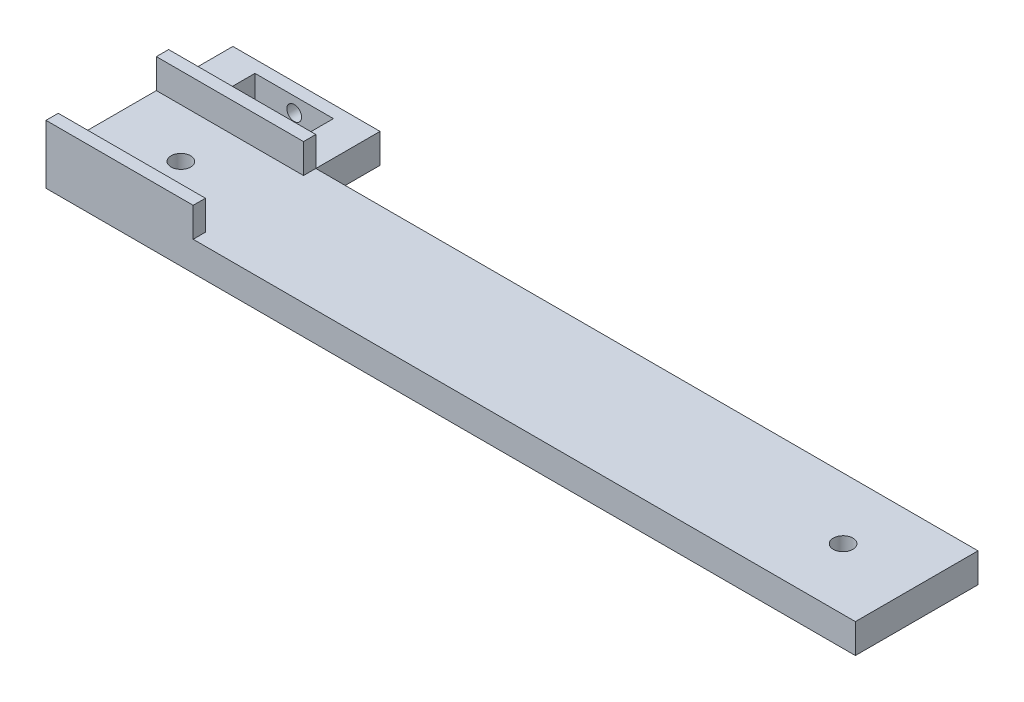
ISO-10303-21;
HEADER;
FILE_DESCRIPTION(('STEP AP214'),'2;1');
FILE_NAME('part.step','',(''),(''),'','','');
FILE_SCHEMA(('AUTOMOTIVE_DESIGN { 1 0 10303 214 1 1 1 1 }'));
ENDSEC;
DATA;
#1=APPLICATION_CONTEXT('core data for automotive mechanical design processes');
#2=APPLICATION_PROTOCOL_DEFINITION('international standard','automotive_design',2000,#1);
#3=PRODUCT_CONTEXT('',#1,'mechanical');
#4=PRODUCT('Part','Part','',(#3));
#5=PRODUCT_RELATED_PRODUCT_CATEGORY('part','',(#4));
#6=PRODUCT_DEFINITION_FORMATION('','',#4);
#7=PRODUCT_DEFINITION_CONTEXT('part definition',#1,'design');
#8=PRODUCT_DEFINITION('design','',#6,#7);
#9=PRODUCT_DEFINITION_SHAPE('','',#8);
#10=(LENGTH_UNIT() NAMED_UNIT(*) SI_UNIT(.MILLI.,.METRE.));
#11=(NAMED_UNIT(*) PLANE_ANGLE_UNIT() SI_UNIT($,.RADIAN.));
#12=(NAMED_UNIT(*) SI_UNIT($,.STERADIAN.) SOLID_ANGLE_UNIT());
#13=UNCERTAINTY_MEASURE_WITH_UNIT(LENGTH_MEASURE(1.E-05),#10,'distance_accuracy_value','');
#14=(GEOMETRIC_REPRESENTATION_CONTEXT(3) GLOBAL_UNCERTAINTY_ASSIGNED_CONTEXT((#13)) GLOBAL_UNIT_ASSIGNED_CONTEXT((#10,
#11,#12)) REPRESENTATION_CONTEXT('',''));
#15=CARTESIAN_POINT('',(0.,0.,0.));
#16=DIRECTION('',(0.,0.,1.));
#17=DIRECTION('',(1.,0.,0.));
#18=AXIS2_PLACEMENT_3D('',#15,#16,#17);
#19=CARTESIAN_POINT('',(0.,6.,0.));
#20=DIRECTION('',(0.,1.,0.));
#21=DIRECTION('',(0.,0.,1.));
#22=AXIS2_PLACEMENT_3D('',#19,#20,#21);
#23=PLANE('',#22);
#24=DIRECTION('',(-1.,0.,0.));
#25=VECTOR('',#24,1.);
#26=CARTESIAN_POINT('',(0.,6.,-2.5));
#27=LINE('',#26,#25);
#28=CARTESIAN_POINT('',(-23.,6.,-2.5));
#29=VERTEX_POINT('',#28);
#30=CARTESIAN_POINT('',(-30.,6.,-2.5));
#31=VERTEX_POINT('',#30);
#32=EDGE_CURVE('E277',#29,#31,#27,.T.);
#33=ORIENTED_EDGE('',*,*,#32,.F.);
#34=DIRECTION('',(0.,0.,-1.));
#35=VECTOR('',#34,1.);
#36=CARTESIAN_POINT('',(-23.,6.,0.));
#37=LINE('',#36,#35);
#38=CARTESIAN_POINT('',(-23.,6.,-13.1));
#39=VERTEX_POINT('',#38);
#40=EDGE_CURVE('E324',#29,#39,#37,.T.);
#41=ORIENTED_EDGE('',*,*,#40,.T.);
#42=DIRECTION('',(1.,0.,0.));
#43=VECTOR('',#42,1.);
#44=CARTESIAN_POINT('',(0.,6.,-13.1));
#45=LINE('',#44,#43);
#46=CARTESIAN_POINT('',(-7.,6.,-13.1));
#47=VERTEX_POINT('',#46);
#48=EDGE_CURVE('E327',#39,#47,#45,.T.);
#49=ORIENTED_EDGE('',*,*,#48,.T.);
#50=DIRECTION('',(0.,0.,-1.));
#51=VECTOR('',#50,1.);
#52=CARTESIAN_POINT('',(-7.,6.,0.));
#53=LINE('',#52,#51);
#54=CARTESIAN_POINT('',(-7.,6.,-2.5));
#55=VERTEX_POINT('',#54);
#56=EDGE_CURVE('E329',#55,#47,#53,.T.);
#57=ORIENTED_EDGE('',*,*,#56,.F.);
#58=CARTESIAN_POINT('',(0.,6.,-2.5));
#59=VERTEX_POINT('',#58);
#60=EDGE_CURVE('E279',#59,#55,#27,.T.);
#61=ORIENTED_EDGE('',*,*,#60,.F.);
#62=DIRECTION('',(0.,0.,1.));
#63=VECTOR('',#62,1.);
#64=CARTESIAN_POINT('',(0.,6.,0.));
#65=LINE('',#64,#63);
#66=CARTESIAN_POINT('',(0.,6.,-15.6));
#67=VERTEX_POINT('',#66);
#68=EDGE_CURVE('E321',#67,#59,#65,.T.);
#69=ORIENTED_EDGE('',*,*,#68,.F.);
#70=DIRECTION('',(-1.,0.,0.));
#71=VECTOR('',#70,1.);
#72=CARTESIAN_POINT('',(0.,6.,-15.6));
#73=LINE('',#72,#71);
#74=CARTESIAN_POINT('',(-30.,6.,-15.6));
#75=VERTEX_POINT('',#74);
#76=EDGE_CURVE('E305',#67,#75,#73,.T.);
#77=ORIENTED_EDGE('',*,*,#76,.T.);
#78=DIRECTION('',(0.,0.,-1.));
#79=VECTOR('',#78,1.);
#80=CARTESIAN_POINT('',(-30.,6.,0.));
#81=LINE('',#80,#79);
#82=EDGE_CURVE('E308',#31,#75,#81,.T.);
#83=ORIENTED_EDGE('',*,*,#82,.F.);
#84=EDGE_LOOP('',(#33,#41,#49,#57,#61,#69,#77,#83));
#85=FACE_BOUND('',#84,.T.);
#86=ADVANCED_FACE('F34',(#85),#23,.T.);
#87=CARTESIAN_POINT('',(-23.,6.,0.));
#88=DIRECTION('',(-1.,0.,0.));
#89=DIRECTION('',(0.,0.,1.));
#90=AXIS2_PLACEMENT_3D('',#87,#88,#89);
#91=PLANE('',#90);
#92=DIRECTION('',(0.,0.,-1.));
#93=VECTOR('',#92,1.);
#94=CARTESIAN_POINT('',(-23.,0.,0.));
#95=LINE('',#94,#93);
#96=CARTESIAN_POINT('',(-23.,0.,-2.5));
#97=VERTEX_POINT('',#96);
#98=CARTESIAN_POINT('',(-23.,0.,-13.1));
#99=VERTEX_POINT('',#98);
#100=EDGE_CURVE('E350',#97,#99,#95,.T.);
#101=ORIENTED_EDGE('',*,*,#100,.T.);
#102=DIRECTION('',(0.,-1.,0.));
#103=VECTOR('',#102,1.);
#104=CARTESIAN_POINT('',(-23.,6.,-13.1));
#105=LINE('',#104,#103);
#106=EDGE_CURVE('E11',#39,#99,#105,.T.);
#107=ORIENTED_EDGE('',*,*,#106,.F.);
#108=ORIENTED_EDGE('',*,*,#40,.F.);
#109=DIRECTION('',(0.,-1.,0.));
#110=VECTOR('',#109,1.);
#111=CARTESIAN_POINT('',(-23.,6.,-2.5));
#112=LINE('',#111,#110);
#113=EDGE_CURVE('E364',#29,#97,#112,.T.);
#114=ORIENTED_EDGE('',*,*,#113,.T.);
#115=EDGE_LOOP('',(#101,#107,#108,#114));
#116=FACE_BOUND('',#115,.T.);
#117=ADVANCED_FACE('F449',(#116),#91,.F.);
#118=CARTESIAN_POINT('',(0.,6.,-13.1));
#119=DIRECTION('',(0.,0.,-1.));
#120=DIRECTION('',(-1.,0.,0.));
#121=AXIS2_PLACEMENT_3D('',#118,#119,#120);
#122=PLANE('',#121);
#123=CARTESIAN_POINT('',(-15.,3.,-13.1));
#124=DIRECTION('',(0.,0.,-1.));
#125=DIRECTION('',(-1.,0.,0.));
#126=AXIS2_PLACEMENT_3D('',#123,#124,#125);
#127=CIRCLE('',#126,1.5);
#128=CARTESIAN_POINT('',(-16.5,3.,-13.1));
#129=VERTEX_POINT('',#128);
#130=EDGE_CURVE('E249',#129,#129,#127,.T.);
#131=ORIENTED_EDGE('',*,*,#130,.T.);
#132=EDGE_LOOP('',(#131));
#133=FACE_BOUND('',#132,.T.);
#134=DIRECTION('',(1.,0.,0.));
#135=VECTOR('',#134,1.);
#136=CARTESIAN_POINT('',(0.,0.,-13.1));
#137=LINE('',#136,#135);
#138=CARTESIAN_POINT('',(-7.,0.,-13.1));
#139=VERTEX_POINT('',#138);
#140=EDGE_CURVE('E353',#99,#139,#137,.T.);
#141=ORIENTED_EDGE('',*,*,#140,.T.);
#142=DIRECTION('',(0.,-1.,0.));
#143=VECTOR('',#142,1.);
#144=CARTESIAN_POINT('',(-7.,6.,-13.1));
#145=LINE('',#144,#143);
#146=EDGE_CURVE('E43',#47,#139,#145,.T.);
#147=ORIENTED_EDGE('',*,*,#146,.F.);
#148=ORIENTED_EDGE('',*,*,#48,.F.);
#149=ORIENTED_EDGE('',*,*,#106,.T.);
#150=EDGE_LOOP('',(#141,#147,#148,#149));
#151=FACE_BOUND('',#150,.T.);
#152=ADVANCED_FACE('F451',(#133,#151),#122,.F.);
#153=CARTESIAN_POINT('',(-7.,6.,0.));
#154=DIRECTION('',(-1.,0.,0.));
#155=DIRECTION('',(0.,0.,1.));
#156=AXIS2_PLACEMENT_3D('',#153,#154,#155);
#157=PLANE('',#156);
#158=DIRECTION('',(0.,0.,-1.));
#159=VECTOR('',#158,1.);
#160=CARTESIAN_POINT('',(-7.,0.,0.));
#161=LINE('',#160,#159);
#162=CARTESIAN_POINT('',(-7.,0.,-2.5));
#163=VERTEX_POINT('',#162);
#164=EDGE_CURVE('E356',#163,#139,#161,.T.);
#165=ORIENTED_EDGE('',*,*,#164,.F.);
#166=DIRECTION('',(0.,-1.,0.));
#167=VECTOR('',#166,1.);
#168=CARTESIAN_POINT('',(-7.,6.,-2.5));
#169=LINE('',#168,#167);
#170=EDGE_CURVE('E366',#55,#163,#169,.T.);
#171=ORIENTED_EDGE('',*,*,#170,.F.);
#172=ORIENTED_EDGE('',*,*,#56,.T.);
#173=ORIENTED_EDGE('',*,*,#146,.T.);
#174=EDGE_LOOP('',(#165,#171,#172,#173));
#175=FACE_BOUND('',#174,.T.);
#176=ADVANCED_FACE('F442',(#175),#157,.T.);
#177=CARTESIAN_POINT('',(0.,6.,-15.6));
#178=DIRECTION('',(0.,0.,1.));
#179=DIRECTION('',(1.,0.,0.));
#180=AXIS2_PLACEMENT_3D('',#177,#178,#179);
#181=PLANE('',#180);
#182=CARTESIAN_POINT('',(-15.,3.,-15.6));
#183=DIRECTION('',(0.,0.,-1.));
#184=DIRECTION('',(-1.,0.,0.));
#185=AXIS2_PLACEMENT_3D('',#182,#183,#184);
#186=CIRCLE('',#185,1.5);
#187=CARTESIAN_POINT('',(-16.5,3.,-15.6));
#188=VERTEX_POINT('',#187);
#189=EDGE_CURVE('E239',#188,#188,#186,.T.);
#190=ORIENTED_EDGE('',*,*,#189,.F.);
#191=EDGE_LOOP('',(#190));
#192=FACE_BOUND('',#191,.T.);
#193=DIRECTION('',(-1.,0.,0.));
#194=VECTOR('',#193,1.);
#195=CARTESIAN_POINT('',(0.,0.,-15.6));
#196=LINE('',#195,#194);
#197=CARTESIAN_POINT('',(0.,0.,-15.6));
#198=VERTEX_POINT('',#197);
#199=CARTESIAN_POINT('',(-30.,0.,-15.6));
#200=VERTEX_POINT('',#199);
#201=EDGE_CURVE('E304',#198,#200,#196,.T.);
#202=ORIENTED_EDGE('',*,*,#201,.T.);
#203=DIRECTION('',(0.,-1.,0.));
#204=VECTOR('',#203,1.);
#205=CARTESIAN_POINT('',(-30.,6.,-15.6));
#206=LINE('',#205,#204);
#207=EDGE_CURVE('E38',#75,#200,#206,.T.);
#208=ORIENTED_EDGE('',*,*,#207,.F.);
#209=ORIENTED_EDGE('',*,*,#76,.F.);
#210=DIRECTION('',(0.,-1.,0.));
#211=VECTOR('',#210,1.);
#212=CARTESIAN_POINT('',(0.,6.,-15.6));
#213=LINE('',#212,#211);
#214=EDGE_CURVE('E335',#67,#198,#213,.T.);
#215=ORIENTED_EDGE('',*,*,#214,.T.);
#216=EDGE_LOOP('',(#202,#208,#209,#215));
#217=FACE_BOUND('',#216,.T.);
#218=ADVANCED_FACE('F36',(#192,#217),#181,.F.);
#219=CARTESIAN_POINT('',(-30.,6.,0.));
#220=DIRECTION('',(-1.,0.,0.));
#221=DIRECTION('',(0.,0.,1.));
#222=AXIS2_PLACEMENT_3D('',#219,#220,#221);
#223=PLANE('',#222);
#224=CARTESIAN_POINT('',(-30.,6.,20.));
#225=VERTEX_POINT('',#224);
#226=CARTESIAN_POINT('',(-30.,6.,0.));
#227=VERTEX_POINT('',#226);
#228=EDGE_CURVE('E310',#225,#227,#81,.T.);
#229=ORIENTED_EDGE('',*,*,#228,.T.);
#230=DIRECTION('',(0.,-1.,0.));
#231=VECTOR('',#230,1.);
#232=CARTESIAN_POINT('',(-30.,12.,0.));
#233=LINE('',#232,#231);
#234=CARTESIAN_POINT('',(-30.,12.,0.));
#235=VERTEX_POINT('',#234);
#236=EDGE_CURVE('E267',#235,#227,#233,.T.);
#237=ORIENTED_EDGE('',*,*,#236,.F.);
#238=DIRECTION('',(0.,0.,-1.));
#239=VECTOR('',#238,1.);
#240=CARTESIAN_POINT('',(-30.,12.,0.));
#241=LINE('',#240,#239);
#242=CARTESIAN_POINT('',(-30.,12.,-2.5));
#243=VERTEX_POINT('',#242);
#244=EDGE_CURVE('E255',#235,#243,#241,.T.);
#245=ORIENTED_EDGE('',*,*,#244,.T.);
#246=DIRECTION('',(0.,-1.,0.));
#247=VECTOR('',#246,1.);
#248=CARTESIAN_POINT('',(-30.,12.,-2.5));
#249=LINE('',#248,#247);
#250=EDGE_CURVE('E269',#243,#31,#249,.T.);
#251=ORIENTED_EDGE('',*,*,#250,.T.);
#252=ORIENTED_EDGE('',*,*,#82,.T.);
#253=ORIENTED_EDGE('',*,*,#207,.T.);
#254=DIRECTION('',(0.,0.,-1.));
#255=VECTOR('',#254,1.);
#256=CARTESIAN_POINT('',(-30.,0.,0.));
#257=LINE('',#256,#255);
#258=CARTESIAN_POINT('',(-30.,0.,22.5));
#259=VERTEX_POINT('',#258);
#260=EDGE_CURVE('E338',#259,#200,#257,.T.);
#261=ORIENTED_EDGE('',*,*,#260,.F.);
#262=DIRECTION('',(0.,-1.,0.));
#263=VECTOR('',#262,1.);
#264=CARTESIAN_POINT('',(-30.,6.,22.5));
#265=LINE('',#264,#263);
#266=CARTESIAN_POINT('',(-30.,12.,22.5));
#267=VERTEX_POINT('',#266);
#268=EDGE_CURVE('E376',#267,#259,#265,.T.);
#269=ORIENTED_EDGE('',*,*,#268,.F.);
#270=DIRECTION('',(0.,0.,-1.));
#271=VECTOR('',#270,1.);
#272=CARTESIAN_POINT('',(-30.,12.,0.));
#273=LINE('',#272,#271);
#274=CARTESIAN_POINT('',(-30.,12.,20.));
#275=VERTEX_POINT('',#274);
#276=EDGE_CURVE('E280',#267,#275,#273,.T.);
#277=ORIENTED_EDGE('',*,*,#276,.T.);
#278=DIRECTION('',(0.,-1.,0.));
#279=VECTOR('',#278,1.);
#280=CARTESIAN_POINT('',(-30.,12.,20.));
#281=LINE('',#280,#279);
#282=EDGE_CURVE('E291',#275,#225,#281,.T.);
#283=ORIENTED_EDGE('',*,*,#282,.T.);
#284=EDGE_LOOP('',(#229,#237,#245,#251,#252,#253,#261,#269,#277,#283));
#285=FACE_BOUND('',#284,.T.);
#286=ADVANCED_FACE('F384',(#285),#223,.T.);
#287=CARTESIAN_POINT('',(0.,6.,22.5));
#288=DIRECTION('',(0.,0.,1.));
#289=DIRECTION('',(1.,0.,0.));
#290=AXIS2_PLACEMENT_3D('',#287,#288,#289);
#291=PLANE('',#290);
#292=DIRECTION('',(-1.,0.,0.));
#293=VECTOR('',#292,1.);
#294=CARTESIAN_POINT('',(0.,6.,22.5));
#295=LINE('',#294,#293);
#296=CARTESIAN_POINT('',(135.,6.,22.4999999999999));
#297=VERTEX_POINT('',#296);
#298=CARTESIAN_POINT('',(0.,6.,22.5));
#299=VERTEX_POINT('',#298);
#300=EDGE_CURVE('E313',#297,#299,#295,.T.);
#301=ORIENTED_EDGE('',*,*,#300,.T.);
#302=DIRECTION('',(0.,-1.,0.));
#303=VECTOR('',#302,1.);
#304=CARTESIAN_POINT('',(0.,12.,22.5));
#305=LINE('',#304,#303);
#306=CARTESIAN_POINT('',(0.,12.,22.5));
#307=VERTEX_POINT('',#306);
#308=EDGE_CURVE('E296',#307,#299,#305,.T.);
#309=ORIENTED_EDGE('',*,*,#308,.F.);
#310=DIRECTION('',(-1.,0.,0.));
#311=VECTOR('',#310,1.);
#312=CARTESIAN_POINT('',(0.,12.,22.5));
#313=LINE('',#312,#311);
#314=EDGE_CURVE('E283',#307,#267,#313,.T.);
#315=ORIENTED_EDGE('',*,*,#314,.T.);
#316=ORIENTED_EDGE('',*,*,#268,.T.);
#317=DIRECTION('',(-1.,0.,0.));
#318=VECTOR('',#317,1.);
#319=CARTESIAN_POINT('',(0.,0.,22.5));
#320=LINE('',#319,#318);
#321=CARTESIAN_POINT('',(135.,0.,22.4999999999999));
#322=VERTEX_POINT('',#321);
#323=EDGE_CURVE('E340',#322,#259,#320,.T.);
#324=ORIENTED_EDGE('',*,*,#323,.F.);
#325=DIRECTION('',(0.,-1.,0.));
#326=VECTOR('',#325,1.);
#327=CARTESIAN_POINT('',(135.,6.,22.4999999999999));
#328=LINE('',#327,#326);
#329=EDGE_CURVE('E375',#297,#322,#328,.T.);
#330=ORIENTED_EDGE('',*,*,#329,.F.);
#331=EDGE_LOOP('',(#301,#309,#315,#316,#324,#330));
#332=FACE_BOUND('',#331,.T.);
#333=ADVANCED_FACE('F404',(#332),#291,.T.);
#334=CARTESIAN_POINT('',(135.,6.,0.));
#335=DIRECTION('',(-1.,0.,0.));
#336=DIRECTION('',(0.,0.,1.));
#337=AXIS2_PLACEMENT_3D('',#334,#335,#336);
#338=PLANE('',#337);
#339=DIRECTION('',(0.,0.,-1.));
#340=VECTOR('',#339,1.);
#341=CARTESIAN_POINT('',(135.,0.,0.));
#342=LINE('',#341,#340);
#343=CARTESIAN_POINT('',(135.,0.,-2.50000000000008));
#344=VERTEX_POINT('',#343);
#345=EDGE_CURVE('E342',#322,#344,#342,.T.);
#346=ORIENTED_EDGE('',*,*,#345,.T.);
#347=DIRECTION('',(0.,-1.,0.));
#348=VECTOR('',#347,1.);
#349=CARTESIAN_POINT('',(135.,6.,-2.50000000000008));
#350=LINE('',#349,#348);
#351=CARTESIAN_POINT('',(135.,6.,-2.50000000000008));
#352=VERTEX_POINT('',#351);
#353=EDGE_CURVE('E372',#352,#344,#350,.T.);
#354=ORIENTED_EDGE('',*,*,#353,.F.);
#355=DIRECTION('',(0.,0.,-1.));
#356=VECTOR('',#355,1.);
#357=CARTESIAN_POINT('',(135.,6.,0.));
#358=LINE('',#357,#356);
#359=EDGE_CURVE('E316',#297,#352,#358,.T.);
#360=ORIENTED_EDGE('',*,*,#359,.F.);
#361=ORIENTED_EDGE('',*,*,#329,.T.);
#362=EDGE_LOOP('',(#346,#354,#360,#361));
#363=FACE_BOUND('',#362,.T.);
#364=ADVANCED_FACE('F407',(#363),#338,.F.);
#365=CARTESIAN_POINT('',(0.,6.,-2.5));
#366=DIRECTION('',(0.,0.,1.));
#367=DIRECTION('',(1.,0.,0.));
#368=AXIS2_PLACEMENT_3D('',#365,#366,#367);
#369=PLANE('',#368);
#370=DIRECTION('',(-1.,0.,0.));
#371=VECTOR('',#370,1.);
#372=CARTESIAN_POINT('',(0.,0.,-2.5));
#373=LINE('',#372,#371);
#374=CARTESIAN_POINT('',(0.,0.,-2.5));
#375=VERTEX_POINT('',#374);
#376=EDGE_CURVE('E344',#344,#375,#373,.T.);
#377=ORIENTED_EDGE('',*,*,#376,.T.);
#378=DIRECTION('',(0.,-1.,0.));
#379=VECTOR('',#378,1.);
#380=CARTESIAN_POINT('',(0.,6.,-2.5));
#381=LINE('',#380,#379);
#382=EDGE_CURVE('E370',#59,#375,#381,.T.);
#383=ORIENTED_EDGE('',*,*,#382,.F.);
#384=DIRECTION('',(-1.,0.,0.));
#385=VECTOR('',#384,1.);
#386=CARTESIAN_POINT('',(0.,6.,-2.5));
#387=LINE('',#386,#385);
#388=EDGE_CURVE('E318',#352,#59,#387,.T.);
#389=ORIENTED_EDGE('',*,*,#388,.F.);
#390=ORIENTED_EDGE('',*,*,#353,.T.);
#391=EDGE_LOOP('',(#377,#383,#389,#390));
#392=FACE_BOUND('',#391,.T.);
#393=ADVANCED_FACE('F400',(#392),#369,.F.);
#394=CARTESIAN_POINT('',(0.,6.,-2.5));
#395=DIRECTION('',(0.,0.,-1.));
#396=DIRECTION('',(-1.,0.,0.));
#397=AXIS2_PLACEMENT_3D('',#394,#395,#396);
#398=PLANE('',#397);
#399=DIRECTION('',(-1.,0.,0.));
#400=VECTOR('',#399,1.);
#401=CARTESIAN_POINT('',(0.,0.500000000000004,-2.5));
#402=LINE('',#401,#400);
#403=CARTESIAN_POINT('',(-13.5566243270259,0.500000000000004,-2.5));
#404=VERTEX_POINT('',#403);
#405=CARTESIAN_POINT('',(-16.4433756729741,0.500000000000004,-2.5));
#406=VERTEX_POINT('',#405);
#407=EDGE_CURVE('E51',#404,#406,#402,.T.);
#408=ORIENTED_EDGE('',*,*,#407,.F.);
#409=DIRECTION('',(-0.5,-0.866025403784439,0.));
#410=VECTOR('',#409,1.);
#411=CARTESIAN_POINT('',(-10.3839745962156,5.99519052838329,-2.5));
#412=LINE('',#411,#410);
#413=CARTESIAN_POINT('',(-12.1132486540519,3.,-2.5));
#414=VERTEX_POINT('',#413);
#415=EDGE_CURVE('E209',#414,#404,#412,.T.);
#416=ORIENTED_EDGE('',*,*,#415,.F.);
#417=DIRECTION('',(0.5,-0.866025403784439,0.));
#418=VECTOR('',#417,1.);
#419=CARTESIAN_POINT('',(-7.78589838486225,-4.49519052838329,-2.5));
#420=LINE('',#419,#418);
#421=CARTESIAN_POINT('',(-13.5566243270259,5.5,-2.5));
#422=VERTEX_POINT('',#421);
#423=EDGE_CURVE('E212',#422,#414,#420,.T.);
#424=ORIENTED_EDGE('',*,*,#423,.F.);
#425=DIRECTION('',(1.,0.,0.));
#426=VECTOR('',#425,1.);
#427=CARTESIAN_POINT('',(0.,5.5,-2.5));
#428=LINE('',#427,#426);
#429=CARTESIAN_POINT('',(-16.4433756729741,5.5,-2.5));
#430=VERTEX_POINT('',#429);
#431=EDGE_CURVE('E232',#430,#422,#428,.T.);
#432=ORIENTED_EDGE('',*,*,#431,.F.);
#433=DIRECTION('',(0.500000000000001,0.866025403784438,0.));
#434=VECTOR('',#433,1.);
#435=CARTESIAN_POINT('',(-14.7141016151377,8.4951905283833,-2.5));
#436=LINE('',#435,#434);
#437=CARTESIAN_POINT('',(-17.8867513459481,3.,-2.5));
#438=VERTEX_POINT('',#437);
#439=EDGE_CURVE('E229',#438,#430,#436,.T.);
#440=ORIENTED_EDGE('',*,*,#439,.F.);
#441=DIRECTION('',(-0.5,0.866025403784439,0.));
#442=VECTOR('',#441,1.);
#443=CARTESIAN_POINT('',(-12.1160254037844,-6.99519052838329,-2.5));
#444=LINE('',#443,#442);
#445=EDGE_CURVE('E226',#406,#438,#444,.T.);
#446=ORIENTED_EDGE('',*,*,#445,.F.);
#447=EDGE_LOOP('',(#408,#416,#424,#432,#440,#446));
#448=FACE_BOUND('',#447,.T.);
#449=DIRECTION('',(1.,0.,0.));
#450=VECTOR('',#449,1.);
#451=CARTESIAN_POINT('',(0.,0.,-2.5));
#452=LINE('',#451,#450);
#453=EDGE_CURVE('E359',#97,#163,#452,.T.);
#454=ORIENTED_EDGE('',*,*,#453,.F.);
#455=ORIENTED_EDGE('',*,*,#113,.F.);
#456=ORIENTED_EDGE('',*,*,#32,.T.);
#457=ORIENTED_EDGE('',*,*,#250,.F.);
#458=DIRECTION('',(1.,0.,0.));
#459=VECTOR('',#458,1.);
#460=CARTESIAN_POINT('',(0.,12.,-2.5));
#461=LINE('',#460,#459);
#462=CARTESIAN_POINT('',(0.,12.,-2.5));
#463=VERTEX_POINT('',#462);
#464=EDGE_CURVE('E252',#243,#463,#461,.T.);
#465=ORIENTED_EDGE('',*,*,#464,.T.);
#466=DIRECTION('',(0.,-1.,0.));
#467=VECTOR('',#466,1.);
#468=CARTESIAN_POINT('',(0.,12.,-2.5));
#469=LINE('',#468,#467);
#470=EDGE_CURVE('E263',#463,#59,#469,.T.);
#471=ORIENTED_EDGE('',*,*,#470,.T.);
#472=ORIENTED_EDGE('',*,*,#60,.T.);
#473=ORIENTED_EDGE('',*,*,#170,.T.);
#474=EDGE_LOOP('',(#454,#455,#456,#457,#465,#471,#472,#473));
#475=FACE_BOUND('',#474,.T.);
#476=ADVANCED_FACE('F434',(#448,#475),#398,.T.);
#477=CARTESIAN_POINT('',(0.,6.,0.));
#478=DIRECTION('',(1.,0.,0.));
#479=DIRECTION('',(0.,0.,-1.));
#480=AXIS2_PLACEMENT_3D('',#477,#478,#479);
#481=PLANE('',#480);
#482=DIRECTION('',(0.,0.,1.));
#483=VECTOR('',#482,1.);
#484=CARTESIAN_POINT('',(0.,0.,0.));
#485=LINE('',#484,#483);
#486=EDGE_CURVE('E347',#198,#375,#485,.T.);
#487=ORIENTED_EDGE('',*,*,#486,.F.);
#488=ORIENTED_EDGE('',*,*,#214,.F.);
#489=ORIENTED_EDGE('',*,*,#68,.T.);
#490=ORIENTED_EDGE('',*,*,#382,.T.);
#491=EDGE_LOOP('',(#487,#488,#489,#490));
#492=FACE_BOUND('',#491,.T.);
#493=ADVANCED_FACE('F395',(#492),#481,.T.);
#494=CARTESIAN_POINT('',(120.,6.,10.));
#495=DIRECTION('',(0.,-1.,0.));
#496=DIRECTION('',(0.,0.,-1.));
#497=AXIS2_PLACEMENT_3D('',#494,#495,#496);
#498=CYLINDRICAL_SURFACE('',#497,2.);
#499=CARTESIAN_POINT('',(120.,6.,10.));
#500=DIRECTION('',(0.,1.,0.));
#501=DIRECTION('',(0.,0.,1.));
#502=AXIS2_PLACEMENT_3D('',#499,#500,#501);
#503=CIRCLE('',#502,2.);
#504=CARTESIAN_POINT('',(120.,6.,12.));
#505=VERTEX_POINT('',#504);
#506=EDGE_CURVE('E332',#505,#505,#503,.F.);
#507=ORIENTED_EDGE('',*,*,#506,.F.);
#508=EDGE_LOOP('',(#507));
#509=FACE_BOUND('',#508,.T.);
#510=CARTESIAN_POINT('',(120.,0.,10.));
#511=DIRECTION('',(0.,1.,0.));
#512=DIRECTION('',(0.,0.,1.));
#513=AXIS2_PLACEMENT_3D('',#510,#511,#512);
#514=CIRCLE('',#513,2.);
#515=CARTESIAN_POINT('',(120.,0.,12.));
#516=VERTEX_POINT('',#515);
#517=EDGE_CURVE('E309',#516,#516,#514,.F.);
#518=ORIENTED_EDGE('',*,*,#517,.T.);
#519=EDGE_LOOP('',(#518));
#520=FACE_BOUND('',#519,.T.);
#521=ADVANCED_FACE('F468',(#509,#520),#498,.F.);
#522=CARTESIAN_POINT('',(-15.,6.,10.));
#523=DIRECTION('',(0.,1.,0.));
#524=DIRECTION('',(0.,0.,1.));
#525=AXIS2_PLACEMENT_3D('',#522,#523,#524);
#526=CIRCLE('',#525,2.);
#527=CARTESIAN_POINT('',(-15.,6.,12.));
#528=VERTEX_POINT('',#527);
#529=EDGE_CURVE('E215',#528,#528,#526,.T.);
#530=ORIENTED_EDGE('',*,*,#529,.F.);
#531=EDGE_LOOP('',(#530));
#532=FACE_BOUND('',#531,.T.);
#533=DIRECTION('',(1.,0.,0.));
#534=VECTOR('',#533,1.);
#535=CARTESIAN_POINT('',(0.,6.,0.));
#536=LINE('',#535,#534);
#537=CARTESIAN_POINT('',(0.,6.,0.));
#538=VERTEX_POINT('',#537);
#539=EDGE_CURVE('E275',#227,#538,#536,.T.);
#540=ORIENTED_EDGE('',*,*,#539,.F.);
#541=ORIENTED_EDGE('',*,*,#228,.F.);
#542=DIRECTION('',(1.,0.,0.));
#543=VECTOR('',#542,1.);
#544=CARTESIAN_POINT('',(0.,6.,20.));
#545=LINE('',#544,#543);
#546=CARTESIAN_POINT('',(0.,6.,20.));
#547=VERTEX_POINT('',#546);
#548=EDGE_CURVE('E298',#225,#547,#545,.T.);
#549=ORIENTED_EDGE('',*,*,#548,.T.);
#550=DIRECTION('',(0.,0.,-1.));
#551=VECTOR('',#550,1.);
#552=CARTESIAN_POINT('',(0.,6.,0.));
#553=LINE('',#552,#551);
#554=EDGE_CURVE('E301',#299,#547,#553,.T.);
#555=ORIENTED_EDGE('',*,*,#554,.F.);
#556=ORIENTED_EDGE('',*,*,#300,.F.);
#557=ORIENTED_EDGE('',*,*,#359,.T.);
#558=ORIENTED_EDGE('',*,*,#388,.T.);
#559=DIRECTION('',(0.,0.,1.));
#560=VECTOR('',#559,1.);
#561=CARTESIAN_POINT('',(0.,6.,0.));
#562=LINE('',#561,#560);
#563=EDGE_CURVE('E272',#59,#538,#562,.T.);
#564=ORIENTED_EDGE('',*,*,#563,.T.);
#565=EDGE_LOOP('',(#540,#541,#549,#555,#556,#557,#558,#564));
#566=FACE_BOUND('',#565,.T.);
#567=ORIENTED_EDGE('',*,*,#506,.T.);
#568=EDGE_LOOP('',(#567));
#569=FACE_BOUND('',#568,.T.);
#570=ADVANCED_FACE('F411',(#532,#566,#569),#23,.T.);
#571=CARTESIAN_POINT('',(0.,0.,0.));
#572=DIRECTION('',(0.,1.,0.));
#573=DIRECTION('',(0.,0.,1.));
#574=AXIS2_PLACEMENT_3D('',#571,#572,#573);
#575=PLANE('',#574);
#576=CARTESIAN_POINT('',(-15.,0.,10.));
#577=DIRECTION('',(0.,1.,0.));
#578=DIRECTION('',(0.,0.,1.));
#579=AXIS2_PLACEMENT_3D('',#576,#577,#578);
#580=CIRCLE('',#579,2.);
#581=CARTESIAN_POINT('',(-15.,0.,12.));
#582=VERTEX_POINT('',#581);
#583=EDGE_CURVE('E227',#582,#582,#580,.T.);
#584=ORIENTED_EDGE('',*,*,#583,.T.);
#585=EDGE_LOOP('',(#584));
#586=FACE_BOUND('',#585,.T.);
#587=ORIENTED_EDGE('',*,*,#453,.T.);
#588=ORIENTED_EDGE('',*,*,#164,.T.);
#589=ORIENTED_EDGE('',*,*,#140,.F.);
#590=ORIENTED_EDGE('',*,*,#100,.F.);
#591=EDGE_LOOP('',(#587,#588,#589,#590));
#592=FACE_BOUND('',#591,.T.);
#593=ORIENTED_EDGE('',*,*,#260,.T.);
#594=ORIENTED_EDGE('',*,*,#201,.F.);
#595=ORIENTED_EDGE('',*,*,#486,.T.);
#596=ORIENTED_EDGE('',*,*,#376,.F.);
#597=ORIENTED_EDGE('',*,*,#345,.F.);
#598=ORIENTED_EDGE('',*,*,#323,.T.);
#599=EDGE_LOOP('',(#593,#594,#595,#596,#597,#598));
#600=FACE_BOUND('',#599,.T.);
#601=ORIENTED_EDGE('',*,*,#517,.F.);
#602=EDGE_LOOP('',(#601));
#603=FACE_BOUND('',#602,.T.);
#604=ADVANCED_FACE('F391',(#586,#592,#600,#603),#575,.F.);
#605=CARTESIAN_POINT('',(0.,12.,0.));
#606=DIRECTION('',(1.,0.,0.));
#607=DIRECTION('',(0.,0.,-1.));
#608=AXIS2_PLACEMENT_3D('',#605,#606,#607);
#609=PLANE('',#608);
#610=ORIENTED_EDGE('',*,*,#308,.T.);
#611=ORIENTED_EDGE('',*,*,#554,.T.);
#612=DIRECTION('',(0.,-1.,0.));
#613=VECTOR('',#612,1.);
#614=CARTESIAN_POINT('',(0.,12.,20.));
#615=LINE('',#614,#613);
#616=CARTESIAN_POINT('',(0.,12.,20.));
#617=VERTEX_POINT('',#616);
#618=EDGE_CURVE('E294',#617,#547,#615,.T.);
#619=ORIENTED_EDGE('',*,*,#618,.F.);
#620=DIRECTION('',(0.,0.,1.));
#621=VECTOR('',#620,1.);
#622=CARTESIAN_POINT('',(0.,12.,0.));
#623=LINE('',#622,#621);
#624=EDGE_CURVE('E286',#617,#307,#623,.T.);
#625=ORIENTED_EDGE('',*,*,#624,.T.);
#626=EDGE_LOOP('',(#610,#611,#619,#625));
#627=FACE_BOUND('',#626,.T.);
#628=ADVANCED_FACE('F415',(#627),#609,.T.);
#629=CARTESIAN_POINT('',(0.,12.,20.));
#630=DIRECTION('',(0.,0.,1.));
#631=DIRECTION('',(1.,0.,0.));
#632=AXIS2_PLACEMENT_3D('',#629,#630,#631);
#633=PLANE('',#632);
#634=ORIENTED_EDGE('',*,*,#548,.F.);
#635=ORIENTED_EDGE('',*,*,#282,.F.);
#636=DIRECTION('',(-1.,0.,0.));
#637=VECTOR('',#636,1.);
#638=CARTESIAN_POINT('',(0.,12.,20.));
#639=LINE('',#638,#637);
#640=EDGE_CURVE('E289',#617,#275,#639,.T.);
#641=ORIENTED_EDGE('',*,*,#640,.F.);
#642=ORIENTED_EDGE('',*,*,#618,.T.);
#643=EDGE_LOOP('',(#634,#635,#641,#642));
#644=FACE_BOUND('',#643,.T.);
#645=ADVANCED_FACE('F524',(#644),#633,.F.);
#646=CARTESIAN_POINT('',(0.,12.,0.));
#647=DIRECTION('',(0.,1.,0.));
#648=DIRECTION('',(0.,0.,1.));
#649=AXIS2_PLACEMENT_3D('',#646,#647,#648);
#650=PLANE('',#649);
#651=ORIENTED_EDGE('',*,*,#276,.F.);
#652=ORIENTED_EDGE('',*,*,#314,.F.);
#653=ORIENTED_EDGE('',*,*,#624,.F.);
#654=ORIENTED_EDGE('',*,*,#640,.T.);
#655=EDGE_LOOP('',(#651,#652,#653,#654));
#656=FACE_BOUND('',#655,.T.);
#657=ADVANCED_FACE('F421',(#656),#650,.T.);
#658=CARTESIAN_POINT('',(0.,12.,0.));
#659=DIRECTION('',(0.,0.,1.));
#660=DIRECTION('',(1.,0.,0.));
#661=AXIS2_PLACEMENT_3D('',#658,#659,#660);
#662=PLANE('',#661);
#663=ORIENTED_EDGE('',*,*,#236,.T.);
#664=ORIENTED_EDGE('',*,*,#539,.T.);
#665=DIRECTION('',(0.,-1.,0.));
#666=VECTOR('',#665,1.);
#667=CARTESIAN_POINT('',(0.,12.,0.));
#668=LINE('',#667,#666);
#669=CARTESIAN_POINT('',(0.,12.,0.));
#670=VERTEX_POINT('',#669);
#671=EDGE_CURVE('E59',#670,#538,#668,.T.);
#672=ORIENTED_EDGE('',*,*,#671,.F.);
#673=DIRECTION('',(-1.,0.,0.));
#674=VECTOR('',#673,1.);
#675=CARTESIAN_POINT('',(0.,12.,0.));
#676=LINE('',#675,#674);
#677=EDGE_CURVE('E258',#670,#235,#676,.T.);
#678=ORIENTED_EDGE('',*,*,#677,.T.);
#679=EDGE_LOOP('',(#663,#664,#672,#678));
#680=FACE_BOUND('',#679,.T.);
#681=ADVANCED_FACE('F425',(#680),#662,.T.);
#682=CARTESIAN_POINT('',(0.,12.,0.));
#683=DIRECTION('',(-1.,0.,0.));
#684=DIRECTION('',(0.,0.,1.));
#685=AXIS2_PLACEMENT_3D('',#682,#683,#684);
#686=PLANE('',#685);
#687=ORIENTED_EDGE('',*,*,#563,.F.);
#688=ORIENTED_EDGE('',*,*,#470,.F.);
#689=DIRECTION('',(0.,0.,-1.));
#690=VECTOR('',#689,1.);
#691=CARTESIAN_POINT('',(0.,12.,0.));
#692=LINE('',#691,#690);
#693=EDGE_CURVE('E261',#670,#463,#692,.T.);
#694=ORIENTED_EDGE('',*,*,#693,.F.);
#695=ORIENTED_EDGE('',*,*,#671,.T.);
#696=EDGE_LOOP('',(#687,#688,#694,#695));
#697=FACE_BOUND('',#696,.T.);
#698=ADVANCED_FACE('F517',(#697),#686,.F.);
#699=CARTESIAN_POINT('',(0.,12.,0.));
#700=DIRECTION('',(0.,1.,0.));
#701=DIRECTION('',(0.,0.,1.));
#702=AXIS2_PLACEMENT_3D('',#699,#700,#701);
#703=PLANE('',#702);
#704=ORIENTED_EDGE('',*,*,#464,.F.);
#705=ORIENTED_EDGE('',*,*,#244,.F.);
#706=ORIENTED_EDGE('',*,*,#677,.F.);
#707=ORIENTED_EDGE('',*,*,#693,.T.);
#708=EDGE_LOOP('',(#704,#705,#706,#707));
#709=FACE_BOUND('',#708,.T.);
#710=ADVANCED_FACE('F430',(#709),#703,.T.);
#711=CARTESIAN_POINT('',(-15.,3.,-10.6));
#712=DIRECTION('',(0.,0.,-1.));
#713=DIRECTION('',(-1.,0.,0.));
#714=AXIS2_PLACEMENT_3D('',#711,#712,#713);
#715=CYLINDRICAL_SURFACE('',#714,1.5);
#716=ORIENTED_EDGE('',*,*,#189,.T.);
#717=EDGE_LOOP('',(#716));
#718=FACE_BOUND('',#717,.T.);
#719=ORIENTED_EDGE('',*,*,#130,.F.);
#720=EDGE_LOOP('',(#719));
#721=FACE_BOUND('',#720,.T.);
#722=ADVANCED_FACE('F511',(#718,#721),#715,.F.);
#723=CARTESIAN_POINT('',(0.,0.500000000000004,0.));
#724=DIRECTION('',(0.,-1.,0.));
#725=DIRECTION('',(0.,0.,-1.));
#726=AXIS2_PLACEMENT_3D('',#723,#724,#725);
#727=PLANE('',#726);
#728=ORIENTED_EDGE('',*,*,#407,.T.);
#729=DIRECTION('',(0.,0.,-1.));
#730=VECTOR('',#729,1.);
#731=CARTESIAN_POINT('',(-16.4433756729741,0.500000000000004,0.));
#732=LINE('',#731,#730);
#733=CARTESIAN_POINT('',(-16.4433756729741,0.500000000000004,0.));
#734=VERTEX_POINT('',#733);
#735=EDGE_CURVE('E186',#734,#406,#732,.T.);
#736=ORIENTED_EDGE('',*,*,#735,.F.);
#737=DIRECTION('',(-1.,0.,0.));
#738=VECTOR('',#737,1.);
#739=CARTESIAN_POINT('',(0.,0.500000000000004,0.));
#740=LINE('',#739,#738);
#741=CARTESIAN_POINT('',(-13.5566243270259,0.500000000000004,0.));
#742=VERTEX_POINT('',#741);
#743=EDGE_CURVE('E190',#742,#734,#740,.T.);
#744=ORIENTED_EDGE('',*,*,#743,.F.);
#745=DIRECTION('',(0.,0.,-1.));
#746=VECTOR('',#745,1.);
#747=CARTESIAN_POINT('',(-13.5566243270259,0.500000000000004,0.));
#748=LINE('',#747,#746);
#749=EDGE_CURVE('E237',#742,#404,#748,.T.);
#750=ORIENTED_EDGE('',*,*,#749,.T.);
#751=EDGE_LOOP('',(#728,#736,#744,#750));
#752=FACE_BOUND('',#751,.T.);
#753=ADVANCED_FACE('F188',(#752),#727,.F.);
#754=CARTESIAN_POINT('',(-10.3839745962156,5.99519052838329,0.));
#755=DIRECTION('',(0.866025403784439,-0.5,0.));
#756=DIRECTION('',(0.5,0.866025403784439,0.));
#757=AXIS2_PLACEMENT_3D('',#754,#755,#756);
#758=PLANE('',#757);
#759=ORIENTED_EDGE('',*,*,#415,.T.);
#760=ORIENTED_EDGE('',*,*,#749,.F.);
#761=DIRECTION('',(-0.5,-0.866025403784439,0.));
#762=VECTOR('',#761,1.);
#763=CARTESIAN_POINT('',(-10.3839745962156,5.99519052838329,0.));
#764=LINE('',#763,#762);
#765=CARTESIAN_POINT('',(-12.1132486540519,3.,0.));
#766=VERTEX_POINT('',#765);
#767=EDGE_CURVE('E196',#766,#742,#764,.T.);
#768=ORIENTED_EDGE('',*,*,#767,.F.);
#769=DIRECTION('',(0.,0.,-1.));
#770=VECTOR('',#769,1.);
#771=CARTESIAN_POINT('',(-12.1132486540519,3.,0.));
#772=LINE('',#771,#770);
#773=EDGE_CURVE('E240',#766,#414,#772,.T.);
#774=ORIENTED_EDGE('',*,*,#773,.T.);
#775=EDGE_LOOP('',(#759,#760,#768,#774));
#776=FACE_BOUND('',#775,.T.);
#777=ADVANCED_FACE('F491',(#776),#758,.F.);
#778=CARTESIAN_POINT('',(-7.78589838486225,-4.49519052838329,0.));
#779=DIRECTION('',(0.866025403784439,0.5,0.));
#780=DIRECTION('',(-0.5,0.866025403784439,0.));
#781=AXIS2_PLACEMENT_3D('',#778,#779,#780);
#782=PLANE('',#781);
#783=ORIENTED_EDGE('',*,*,#423,.T.);
#784=ORIENTED_EDGE('',*,*,#773,.F.);
#785=DIRECTION('',(0.5,-0.866025403784439,0.));
#786=VECTOR('',#785,1.);
#787=CARTESIAN_POINT('',(-7.78589838486225,-4.49519052838329,0.));
#788=LINE('',#787,#786);
#789=CARTESIAN_POINT('',(-13.5566243270259,5.5,0.));
#790=VERTEX_POINT('',#789);
#791=EDGE_CURVE('E222',#790,#766,#788,.T.);
#792=ORIENTED_EDGE('',*,*,#791,.F.);
#793=DIRECTION('',(0.,0.,-1.));
#794=VECTOR('',#793,1.);
#795=CARTESIAN_POINT('',(-13.5566243270259,5.5,0.));
#796=LINE('',#795,#794);
#797=EDGE_CURVE('E242',#790,#422,#796,.T.);
#798=ORIENTED_EDGE('',*,*,#797,.T.);
#799=EDGE_LOOP('',(#783,#784,#792,#798));
#800=FACE_BOUND('',#799,.T.);
#801=ADVANCED_FACE('F494',(#800),#782,.F.);
#802=CARTESIAN_POINT('',(0.,5.5,0.));
#803=DIRECTION('',(0.,1.,0.));
#804=DIRECTION('',(0.,0.,1.));
#805=AXIS2_PLACEMENT_3D('',#802,#803,#804);
#806=PLANE('',#805);
#807=ORIENTED_EDGE('',*,*,#431,.T.);
#808=ORIENTED_EDGE('',*,*,#797,.F.);
#809=DIRECTION('',(1.,0.,0.));
#810=VECTOR('',#809,1.);
#811=CARTESIAN_POINT('',(0.,5.5,0.));
#812=LINE('',#811,#810);
#813=CARTESIAN_POINT('',(-16.4433756729741,5.5,0.));
#814=VERTEX_POINT('',#813);
#815=EDGE_CURVE('E219',#814,#790,#812,.T.);
#816=ORIENTED_EDGE('',*,*,#815,.F.);
#817=DIRECTION('',(0.,0.,-1.));
#818=VECTOR('',#817,1.);
#819=CARTESIAN_POINT('',(-16.4433756729741,5.5,0.));
#820=LINE('',#819,#818);
#821=EDGE_CURVE('E244',#814,#430,#820,.T.);
#822=ORIENTED_EDGE('',*,*,#821,.T.);
#823=EDGE_LOOP('',(#807,#808,#816,#822));
#824=FACE_BOUND('',#823,.T.);
#825=ADVANCED_FACE('F498',(#824),#806,.F.);
#826=CARTESIAN_POINT('',(-14.7141016151377,8.4951905283833,0.));
#827=DIRECTION('',(-0.866025403784438,0.500000000000001,0.));
#828=DIRECTION('',(-0.500000000000001,-0.866025403784438,0.));
#829=AXIS2_PLACEMENT_3D('',#826,#827,#828);
#830=PLANE('',#829);
#831=ORIENTED_EDGE('',*,*,#439,.T.);
#832=ORIENTED_EDGE('',*,*,#821,.F.);
#833=DIRECTION('',(0.500000000000001,0.866025403784438,0.));
#834=VECTOR('',#833,1.);
#835=CARTESIAN_POINT('',(-14.7141016151377,8.4951905283833,0.));
#836=LINE('',#835,#834);
#837=CARTESIAN_POINT('',(-17.8867513459481,3.,0.));
#838=VERTEX_POINT('',#837);
#839=EDGE_CURVE('E204',#838,#814,#836,.T.);
#840=ORIENTED_EDGE('',*,*,#839,.F.);
#841=DIRECTION('',(0.,0.,-1.));
#842=VECTOR('',#841,1.);
#843=CARTESIAN_POINT('',(-17.8867513459481,3.,0.));
#844=LINE('',#843,#842);
#845=EDGE_CURVE('E195',#838,#438,#844,.T.);
#846=ORIENTED_EDGE('',*,*,#845,.T.);
#847=EDGE_LOOP('',(#831,#832,#840,#846));
#848=FACE_BOUND('',#847,.T.);
#849=ADVANCED_FACE('F502',(#848),#830,.F.);
#850=CARTESIAN_POINT('',(-12.1160254037844,-6.99519052838329,0.));
#851=DIRECTION('',(-0.866025403784439,-0.5,0.));
#852=DIRECTION('',(0.5,-0.866025403784439,0.));
#853=AXIS2_PLACEMENT_3D('',#850,#851,#852);
#854=PLANE('',#853);
#855=ORIENTED_EDGE('',*,*,#445,.T.);
#856=ORIENTED_EDGE('',*,*,#845,.F.);
#857=DIRECTION('',(-0.5,0.866025403784439,0.));
#858=VECTOR('',#857,1.);
#859=CARTESIAN_POINT('',(-12.1160254037844,-6.99519052838329,0.));
#860=LINE('',#859,#858);
#861=EDGE_CURVE('E199',#734,#838,#860,.T.);
#862=ORIENTED_EDGE('',*,*,#861,.F.);
#863=ORIENTED_EDGE('',*,*,#735,.T.);
#864=EDGE_LOOP('',(#855,#856,#862,#863));
#865=FACE_BOUND('',#864,.T.);
#866=ADVANCED_FACE('F200',(#865),#854,.F.);
#867=CARTESIAN_POINT('',(0.,0.,0.));
#868=DIRECTION('',(0.,0.,-1.));
#869=DIRECTION('',(-1.,0.,0.));
#870=AXIS2_PLACEMENT_3D('',#867,#868,#869);
#871=PLANE('',#870);
#872=ORIENTED_EDGE('',*,*,#743,.T.);
#873=ORIENTED_EDGE('',*,*,#861,.T.);
#874=ORIENTED_EDGE('',*,*,#839,.T.);
#875=ORIENTED_EDGE('',*,*,#815,.T.);
#876=ORIENTED_EDGE('',*,*,#791,.T.);
#877=ORIENTED_EDGE('',*,*,#767,.T.);
#878=EDGE_LOOP('',(#872,#873,#874,#875,#876,#877));
#879=FACE_BOUND('',#878,.T.);
#880=ADVANCED_FACE('F206',(#879),#871,.T.);
#881=CARTESIAN_POINT('',(-15.,0.,10.));
#882=DIRECTION('',(0.,1.,0.));
#883=DIRECTION('',(0.,0.,1.));
#884=AXIS2_PLACEMENT_3D('',#881,#882,#883);
#885=CYLINDRICAL_SURFACE('',#884,2.);
#886=ORIENTED_EDGE('',*,*,#583,.F.);
#887=EDGE_LOOP('',(#886));
#888=FACE_BOUND('',#887,.T.);
#889=ORIENTED_EDGE('',*,*,#529,.T.);
#890=EDGE_LOOP('',(#889));
#891=FACE_BOUND('',#890,.T.);
#892=ADVANCED_FACE('F483',(#888,#891),#885,.F.);
#893=CLOSED_SHELL('',(#86,#117,#152,#176,#218,#286,#333,#364,#393,#476,#493,#521,#570,#604,#628,
#645,#657,#681,#698,#710,#722,#753,#777,#801,#825,#849,#866,#880,#892));
#894=MANIFOLD_SOLID_BREP('B2',#893);
#895=ADVANCED_BREP_SHAPE_REPRESENTATION('',(#18,#894),#14);
#896=SHAPE_DEFINITION_REPRESENTATION(#9,#895);
ENDSEC;
END-ISO-10303-21;
